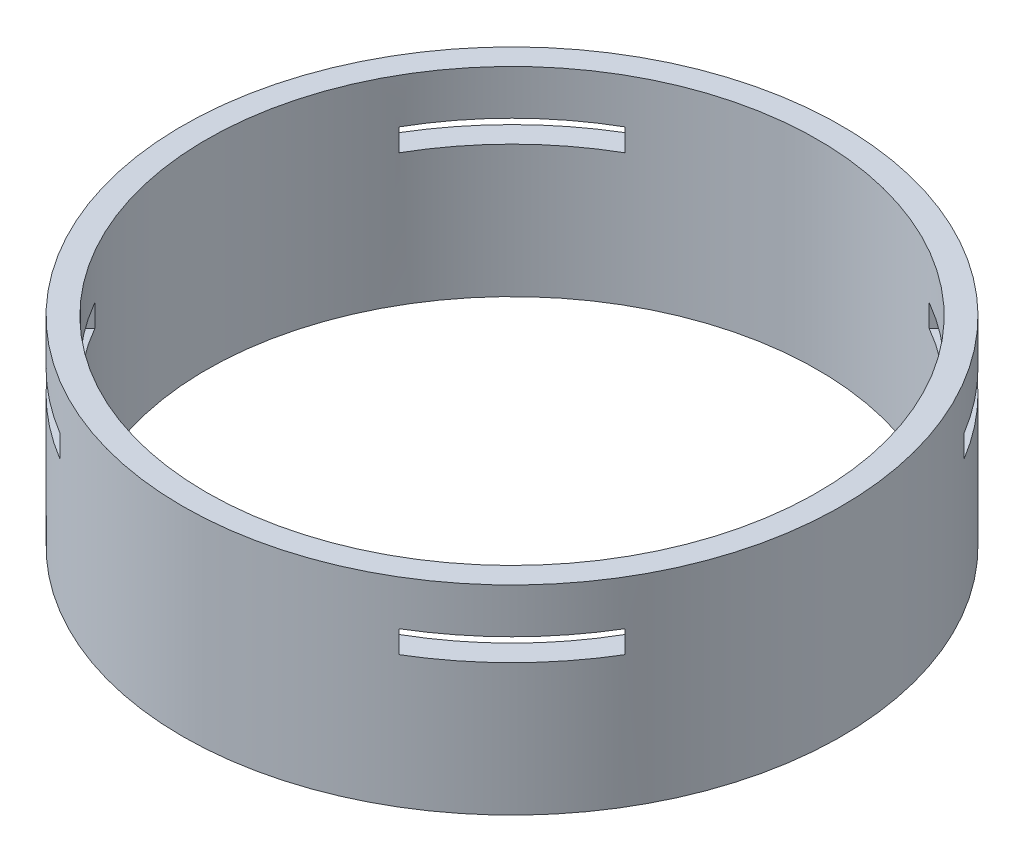
ISO-10303-21;
HEADER;
FILE_DESCRIPTION(('STEP AP214'),'2;1');
FILE_NAME('part.step','',(''),(''),'','','');
FILE_SCHEMA(('AUTOMOTIVE_DESIGN { 1 0 10303 214 1 1 1 1 }'));
ENDSEC;
DATA;
#1=APPLICATION_CONTEXT('core data for automotive mechanical design processes');
#2=APPLICATION_PROTOCOL_DEFINITION('international standard','automotive_design',2000,#1);
#3=PRODUCT_CONTEXT('',#1,'mechanical');
#4=PRODUCT('Part','Part','',(#3));
#5=PRODUCT_RELATED_PRODUCT_CATEGORY('part','',(#4));
#6=PRODUCT_DEFINITION_FORMATION('','',#4);
#7=PRODUCT_DEFINITION_CONTEXT('part definition',#1,'design');
#8=PRODUCT_DEFINITION('design','',#6,#7);
#9=PRODUCT_DEFINITION_SHAPE('','',#8);
#10=(LENGTH_UNIT() NAMED_UNIT(*) SI_UNIT(.MILLI.,.METRE.));
#11=(NAMED_UNIT(*) PLANE_ANGLE_UNIT() SI_UNIT($,.RADIAN.));
#12=(NAMED_UNIT(*) SI_UNIT($,.STERADIAN.) SOLID_ANGLE_UNIT());
#13=UNCERTAINTY_MEASURE_WITH_UNIT(LENGTH_MEASURE(1.E-05),#10,'distance_accuracy_value','');
#14=(GEOMETRIC_REPRESENTATION_CONTEXT(3) GLOBAL_UNCERTAINTY_ASSIGNED_CONTEXT((#13)) GLOBAL_UNIT_ASSIGNED_CONTEXT((#10,
#11,#12)) REPRESENTATION_CONTEXT('',''));
#15=CARTESIAN_POINT('',(0.,0.,0.));
#16=DIRECTION('',(0.,0.,1.));
#17=DIRECTION('',(1.,0.,0.));
#18=AXIS2_PLACEMENT_3D('',#15,#16,#17);
#19=CARTESIAN_POINT('',(0.,25.4,0.));
#20=DIRECTION('',(0.,1.,0.));
#21=DIRECTION('',(0.,0.,1.));
#22=AXIS2_PLACEMENT_3D('',#19,#20,#21);
#23=PLANE('',#22);
#24=CARTESIAN_POINT('',(0.,25.4,0.));
#25=DIRECTION('',(0.,1.,0.));
#26=DIRECTION('',(0.,0.,1.));
#27=AXIS2_PLACEMENT_3D('',#24,#25,#26);
#28=CIRCLE('',#27,83.9724);
#29=CARTESIAN_POINT('',(0.,25.4,83.9724));
#30=VERTEX_POINT('',#29);
#31=EDGE_CURVE('E214',#30,#30,#28,.T.);
#32=ORIENTED_EDGE('',*,*,#31,.T.);
#33=EDGE_LOOP('',(#32));
#34=FACE_BOUND('',#33,.T.);
#35=CARTESIAN_POINT('',(0.,25.4,0.));
#36=DIRECTION('',(0.,1.,0.));
#37=DIRECTION('',(0.,0.,1.));
#38=AXIS2_PLACEMENT_3D('',#35,#36,#37);
#39=CIRCLE('',#38,77.8764);
#40=CARTESIAN_POINT('',(0.,25.4,77.8764));
#41=VERTEX_POINT('',#40);
#42=EDGE_CURVE('E217',#41,#41,#39,.T.);
#43=ORIENTED_EDGE('',*,*,#42,.F.);
#44=EDGE_LOOP('',(#43));
#45=FACE_BOUND('',#44,.T.);
#46=ADVANCED_FACE('F37',(#34,#45),#23,.T.);
#47=CARTESIAN_POINT('',(0.,-25.4,0.));
#48=DIRECTION('',(0.,1.,0.));
#49=DIRECTION('',(0.,0.,1.));
#50=AXIS2_PLACEMENT_3D('',#47,#48,#49);
#51=PLANE('',#50);
#52=CARTESIAN_POINT('',(0.,-25.4,0.));
#53=DIRECTION('',(0.,1.,0.));
#54=DIRECTION('',(0.,0.,1.));
#55=AXIS2_PLACEMENT_3D('',#52,#53,#54);
#56=CIRCLE('',#55,83.9724);
#57=CARTESIAN_POINT('',(0.,-25.4,83.9724));
#58=VERTEX_POINT('',#57);
#59=EDGE_CURVE('E219',#58,#58,#56,.T.);
#60=ORIENTED_EDGE('',*,*,#59,.F.);
#61=EDGE_LOOP('',(#60));
#62=FACE_BOUND('',#61,.T.);
#63=CARTESIAN_POINT('',(0.,-25.4,0.));
#64=DIRECTION('',(0.,1.,0.));
#65=DIRECTION('',(0.,0.,1.));
#66=AXIS2_PLACEMENT_3D('',#63,#64,#65);
#67=CIRCLE('',#66,77.8764);
#68=CARTESIAN_POINT('',(0.,-25.4,77.8764));
#69=VERTEX_POINT('',#68);
#70=EDGE_CURVE('E220',#69,#69,#67,.T.);
#71=ORIENTED_EDGE('',*,*,#70,.T.);
#72=EDGE_LOOP('',(#71));
#73=FACE_BOUND('',#72,.T.);
#74=ADVANCED_FACE('F205',(#62,#73),#51,.F.);
#75=CARTESIAN_POINT('',(0.,25.4,0.));
#76=DIRECTION('',(0.,-1.,0.));
#77=DIRECTION('',(0.,0.,-1.));
#78=AXIS2_PLACEMENT_3D('',#75,#76,#77);
#79=CYLINDRICAL_SURFACE('',#78,83.9724);
#80=CARTESIAN_POINT('',(0.,8.255,0.));
#81=DIRECTION('',(0.,-1.,0.));
#82=DIRECTION('',(0.,0.,-1.));
#83=AXIS2_PLACEMENT_3D('',#80,#81,#82);
#84=CIRCLE('',#83,83.9724);
#85=CARTESIAN_POINT('',(-71.9811755742217,8.255,-43.2443559867999));
#86=VERTEX_POINT('',#85);
#87=CARTESIAN_POINT('',(-43.2443559868005,8.255,-71.9811755742213));
#88=VERTEX_POINT('',#87);
#89=EDGE_CURVE('E431',#86,#88,#84,.T.);
#90=ORIENTED_EDGE('',*,*,#89,.T.);
#91=DIRECTION('',(0.,-1.,0.));
#92=VECTOR('',#91,1.);
#93=CARTESIAN_POINT('',(-43.2443559868005,25.4,-71.9811755742213));
#94=LINE('',#93,#92);
#95=CARTESIAN_POINT('',(-43.2443559868005,13.97,-71.9811755742213));
#96=VERTEX_POINT('',#95);
#97=EDGE_CURVE('E434',#88,#96,#94,.F.);
#98=ORIENTED_EDGE('',*,*,#97,.T.);
#99=CARTESIAN_POINT('',(0.,13.97,0.));
#100=DIRECTION('',(0.,1.,0.));
#101=DIRECTION('',(0.,0.,1.));
#102=AXIS2_PLACEMENT_3D('',#99,#100,#101);
#103=CIRCLE('',#102,83.9724);
#104=CARTESIAN_POINT('',(-71.9811755742217,13.97,-43.2443559867999));
#105=VERTEX_POINT('',#104);
#106=EDGE_CURVE('E428',#96,#105,#103,.T.);
#107=ORIENTED_EDGE('',*,*,#106,.T.);
#108=DIRECTION('',(0.,-1.,0.));
#109=VECTOR('',#108,1.);
#110=CARTESIAN_POINT('',(-71.9811755742217,25.4,-43.2443559867999));
#111=LINE('',#110,#109);
#112=EDGE_CURVE('E291',#105,#86,#111,.T.);
#113=ORIENTED_EDGE('',*,*,#112,.T.);
#114=EDGE_LOOP('',(#90,#98,#107,#113));
#115=FACE_BOUND('',#114,.T.);
#116=CARTESIAN_POINT('',(-43.2443559868002,8.255,71.9811755742215));
#117=VERTEX_POINT('',#116);
#118=CARTESIAN_POINT('',(-71.9811755742215,8.255,43.2443559868002));
#119=VERTEX_POINT('',#118);
#120=EDGE_CURVE('E398',#117,#119,#84,.T.);
#121=ORIENTED_EDGE('',*,*,#120,.T.);
#122=DIRECTION('',(0.,-1.,0.));
#123=VECTOR('',#122,1.);
#124=CARTESIAN_POINT('',(-71.9811755742215,25.4,43.2443559868002));
#125=LINE('',#124,#123);
#126=CARTESIAN_POINT('',(-71.9811755742215,13.97,43.2443559868002));
#127=VERTEX_POINT('',#126);
#128=EDGE_CURVE('E423',#119,#127,#125,.F.);
#129=ORIENTED_EDGE('',*,*,#128,.T.);
#130=CARTESIAN_POINT('',(-43.2443559868002,13.97,71.9811755742215));
#131=VERTEX_POINT('',#130);
#132=EDGE_CURVE('E426',#127,#131,#103,.T.);
#133=ORIENTED_EDGE('',*,*,#132,.T.);
#134=DIRECTION('',(0.,-1.,0.));
#135=VECTOR('',#134,1.);
#136=CARTESIAN_POINT('',(-43.2443559868002,25.4,71.9811755742215));
#137=LINE('',#136,#135);
#138=EDGE_CURVE('E403',#131,#117,#137,.T.);
#139=ORIENTED_EDGE('',*,*,#138,.T.);
#140=EDGE_LOOP('',(#121,#129,#133,#139));
#141=FACE_BOUND('',#140,.T.);
#142=CARTESIAN_POINT('',(43.244355986801,13.97,71.981175574221));
#143=VERTEX_POINT('',#142);
#144=CARTESIAN_POINT('',(71.9811755742216,13.97,43.2443559867999));
#145=VERTEX_POINT('',#144);
#146=EDGE_CURVE('E429',#143,#145,#103,.T.);
#147=ORIENTED_EDGE('',*,*,#146,.T.);
#148=DIRECTION('',(0.,-1.,0.));
#149=VECTOR('',#148,1.);
#150=CARTESIAN_POINT('',(71.9811755742216,25.4,43.2443559867999));
#151=LINE('',#150,#149);
#152=CARTESIAN_POINT('',(71.9811755742216,8.255,43.2443559867999));
#153=VERTEX_POINT('',#152);
#154=EDGE_CURVE('E328',#145,#153,#151,.T.);
#155=ORIENTED_EDGE('',*,*,#154,.T.);
#156=CARTESIAN_POINT('',(43.244355986801,8.255,71.981175574221));
#157=VERTEX_POINT('',#156);
#158=EDGE_CURVE('E433',#153,#157,#84,.T.);
#159=ORIENTED_EDGE('',*,*,#158,.T.);
#160=DIRECTION('',(0.,-1.,0.));
#161=VECTOR('',#160,1.);
#162=CARTESIAN_POINT('',(43.244355986801,25.4,71.981175574221));
#163=LINE('',#162,#161);
#164=EDGE_CURVE('E419',#157,#143,#163,.F.);
#165=ORIENTED_EDGE('',*,*,#164,.T.);
#166=EDGE_LOOP('',(#147,#155,#159,#165));
#167=FACE_BOUND('',#166,.T.);
#168=CARTESIAN_POINT('',(0.,8.255,0.));
#169=DIRECTION('',(0.,-1.,0.));
#170=DIRECTION('',(0.,0.,-1.));
#171=AXIS2_PLACEMENT_3D('',#168,#169,#170);
#172=CIRCLE('',#171,83.9724);
#173=CARTESIAN_POINT('',(43.2443559868002,8.255,-71.9811755742215));
#174=VERTEX_POINT('',#173);
#175=CARTESIAN_POINT('',(71.9811755742215,8.255,-43.2443559868002));
#176=VERTEX_POINT('',#175);
#177=EDGE_CURVE('E335',#174,#176,#172,.T.);
#178=ORIENTED_EDGE('',*,*,#177,.T.);
#179=DIRECTION('',(0.,-1.,0.));
#180=VECTOR('',#179,1.);
#181=CARTESIAN_POINT('',(71.9811755742215,25.4,-43.2443559868002));
#182=LINE('',#181,#180);
#183=CARTESIAN_POINT('',(71.9811755742215,13.97,-43.2443559868002));
#184=VERTEX_POINT('',#183);
#185=EDGE_CURVE('E225',#176,#184,#182,.F.);
#186=ORIENTED_EDGE('',*,*,#185,.T.);
#187=CARTESIAN_POINT('',(0.,13.97,0.));
#188=DIRECTION('',(0.,1.,0.));
#189=DIRECTION('',(0.,0.,1.));
#190=AXIS2_PLACEMENT_3D('',#187,#188,#189);
#191=CIRCLE('',#190,83.9724);
#192=CARTESIAN_POINT('',(43.2443559868002,13.97,-71.9811755742215));
#193=VERTEX_POINT('',#192);
#194=EDGE_CURVE('E318',#184,#193,#191,.T.);
#195=ORIENTED_EDGE('',*,*,#194,.T.);
#196=DIRECTION('',(0.,-1.,0.));
#197=VECTOR('',#196,1.);
#198=CARTESIAN_POINT('',(43.2443559868002,25.4,-71.9811755742215));
#199=LINE('',#198,#197);
#200=EDGE_CURVE('E322',#193,#174,#199,.T.);
#201=ORIENTED_EDGE('',*,*,#200,.T.);
#202=EDGE_LOOP('',(#178,#186,#195,#201));
#203=FACE_BOUND('',#202,.T.);
#204=ORIENTED_EDGE('',*,*,#31,.F.);
#205=EDGE_LOOP('',(#204));
#206=FACE_BOUND('',#205,.T.);
#207=ORIENTED_EDGE('',*,*,#59,.T.);
#208=EDGE_LOOP('',(#207));
#209=FACE_BOUND('',#208,.T.);
#210=ADVANCED_FACE('F39',(#115,#141,#167,#203,#206,#209),#79,.T.);
#211=CARTESIAN_POINT('',(0.,25.4,0.));
#212=DIRECTION('',(0.,-1.,0.));
#213=DIRECTION('',(0.,0.,-1.));
#214=AXIS2_PLACEMENT_3D('',#211,#212,#213);
#215=CYLINDRICAL_SURFACE('',#214,77.8764);
#216=CARTESIAN_POINT('',(73.3508964323165,-16.148738026056,26.1606511680343));
#217=CARTESIAN_POINT('',(73.3168874799224,-15.24,26.2875743062813));
#218=CARTESIAN_POINT('',(73.3508964323165,-14.331261973944,26.1606511680343));
#219=B_SPLINE_CURVE_WITH_KNOTS('',2,(#216,#217,#218),.UNSPECIFIED.,.F.,.F.,(3,3),(0.,1.),.UNSPECIFIED.);
#220=CARTESIAN_POINT('',(73.3508964323165,-16.148738026056,26.1606511680343));
#221=VERTEX_POINT('',#220);
#222=CARTESIAN_POINT('',(73.3508964323165,-14.331261973944,26.1606511680343));
#223=VERTEX_POINT('',#222);
#224=EDGE_CURVE('E11',#221,#223,#219,.T.);
#225=ORIENTED_EDGE('',*,*,#224,.F.);
#226=DIRECTION('',(0.,-1.,0.));
#227=VECTOR('',#226,1.);
#228=CARTESIAN_POINT('',(73.3508964323165,25.4,26.1606511680343));
#229=LINE('',#228,#227);
#230=EDGE_CURVE('E41',#223,#221,#229,.T.);
#231=ORIENTED_EDGE('',*,*,#230,.F.);
#232=EDGE_LOOP('',(#225,#231));
#233=FACE_BOUND('',#232,.T.);
#234=CARTESIAN_POINT('',(76.6040652847646,-14.331261973944,14.0196597250976));
#235=CARTESIAN_POINT('',(76.6380742371587,-15.24,13.8927365868506));
#236=CARTESIAN_POINT('',(76.6040652847646,-16.148738026056,14.0196597250976));
#237=B_SPLINE_CURVE_WITH_KNOTS('',2,(#234,#235,#236),.UNSPECIFIED.,.F.,.F.,(3,3),(0.,1.),.UNSPECIFIED.);
#238=CARTESIAN_POINT('',(76.6040652847646,-14.331261973944,14.0196597250976));
#239=VERTEX_POINT('',#238);
#240=CARTESIAN_POINT('',(76.6040652847646,-16.148738026056,14.0196597250976));
#241=VERTEX_POINT('',#240);
#242=EDGE_CURVE('E58',#239,#241,#237,.T.);
#243=ORIENTED_EDGE('',*,*,#242,.F.);
#244=DIRECTION('',(0.,-1.,0.));
#245=VECTOR('',#244,1.);
#246=CARTESIAN_POINT('',(76.6040652847646,25.4,14.0196597250976));
#247=LINE('',#246,#245);
#248=EDGE_CURVE('E160',#241,#239,#247,.F.);
#249=ORIENTED_EDGE('',*,*,#248,.F.);
#250=EDGE_LOOP('',(#243,#249));
#251=FACE_BOUND('',#250,.T.);
#252=DIRECTION('',(0.,-1.,0.));
#253=VECTOR('',#252,1.);
#254=CARTESIAN_POINT('',(-38.7909321743765,25.4,-67.5277517617973));
#255=LINE('',#254,#253);
#256=CARTESIAN_POINT('',(-38.7909321743765,8.255,-67.5277517617974));
#257=VERTEX_POINT('',#256);
#258=CARTESIAN_POINT('',(-38.7909321743765,13.97,-67.5277517617974));
#259=VERTEX_POINT('',#258);
#260=EDGE_CURVE('E163',#257,#259,#255,.F.);
#261=ORIENTED_EDGE('',*,*,#260,.F.);
#262=CARTESIAN_POINT('',(0.,8.255,0.));
#263=DIRECTION('',(0.,-1.,0.));
#264=DIRECTION('',(0.,0.,-1.));
#265=AXIS2_PLACEMENT_3D('',#262,#263,#264);
#266=CIRCLE('',#265,77.8764);
#267=CARTESIAN_POINT('',(-67.5277517617976,8.255,-38.7909321743759));
#268=VERTEX_POINT('',#267);
#269=EDGE_CURVE('E250',#268,#257,#266,.T.);
#270=ORIENTED_EDGE('',*,*,#269,.F.);
#271=DIRECTION('',(0.,-1.,0.));
#272=VECTOR('',#271,1.);
#273=CARTESIAN_POINT('',(-67.5277517617977,25.4,-38.7909321743759));
#274=LINE('',#273,#272);
#275=CARTESIAN_POINT('',(-67.5277517617977,13.97,-38.7909321743759));
#276=VERTEX_POINT('',#275);
#277=EDGE_CURVE('E257',#276,#268,#274,.T.);
#278=ORIENTED_EDGE('',*,*,#277,.F.);
#279=CARTESIAN_POINT('',(0.,13.97,0.));
#280=DIRECTION('',(0.,1.,0.));
#281=DIRECTION('',(0.,0.,1.));
#282=AXIS2_PLACEMENT_3D('',#279,#280,#281);
#283=CIRCLE('',#282,77.8764);
#284=EDGE_CURVE('E245',#259,#276,#283,.T.);
#285=ORIENTED_EDGE('',*,*,#284,.F.);
#286=EDGE_LOOP('',(#261,#270,#278,#285));
#287=FACE_BOUND('',#286,.T.);
#288=DIRECTION('',(0.,-1.,0.));
#289=VECTOR('',#288,1.);
#290=CARTESIAN_POINT('',(-67.5277517617975,25.4,38.7909321743763));
#291=LINE('',#290,#289);
#292=CARTESIAN_POINT('',(-67.5277517617975,8.255,38.7909321743762));
#293=VERTEX_POINT('',#292);
#294=CARTESIAN_POINT('',(-67.5277517617975,13.97,38.7909321743762));
#295=VERTEX_POINT('',#294);
#296=EDGE_CURVE('E255',#293,#295,#291,.F.);
#297=ORIENTED_EDGE('',*,*,#296,.F.);
#298=CARTESIAN_POINT('',(-38.7909321743762,8.255,67.5277517617975));
#299=VERTEX_POINT('',#298);
#300=EDGE_CURVE('E251',#299,#293,#266,.T.);
#301=ORIENTED_EDGE('',*,*,#300,.F.);
#302=DIRECTION('',(0.,-1.,0.));
#303=VECTOR('',#302,1.);
#304=CARTESIAN_POINT('',(-38.7909321743762,25.4,67.5277517617975));
#305=LINE('',#304,#303);
#306=CARTESIAN_POINT('',(-38.7909321743762,13.97,67.5277517617975));
#307=VERTEX_POINT('',#306);
#308=EDGE_CURVE('E253',#307,#299,#305,.T.);
#309=ORIENTED_EDGE('',*,*,#308,.F.);
#310=EDGE_CURVE('E246',#295,#307,#283,.T.);
#311=ORIENTED_EDGE('',*,*,#310,.F.);
#312=EDGE_LOOP('',(#297,#301,#309,#311));
#313=FACE_BOUND('',#312,.T.);
#314=DIRECTION('',(0.,-1.,0.));
#315=VECTOR('',#314,1.);
#316=CARTESIAN_POINT('',(67.5277517617976,25.4,38.790932174376));
#317=LINE('',#316,#315);
#318=CARTESIAN_POINT('',(67.5277517617976,13.97,38.790932174376));
#319=VERTEX_POINT('',#318);
#320=CARTESIAN_POINT('',(67.5277517617976,8.255,38.790932174376));
#321=VERTEX_POINT('',#320);
#322=EDGE_CURVE('E249',#319,#321,#317,.T.);
#323=ORIENTED_EDGE('',*,*,#322,.F.);
#324=CARTESIAN_POINT('',(38.790932174377,13.97,67.5277517617971));
#325=VERTEX_POINT('',#324);
#326=EDGE_CURVE('E242',#325,#319,#283,.T.);
#327=ORIENTED_EDGE('',*,*,#326,.F.);
#328=DIRECTION('',(0.,-1.,0.));
#329=VECTOR('',#328,1.);
#330=CARTESIAN_POINT('',(38.7909321743769,25.4,67.5277517617971));
#331=LINE('',#330,#329);
#332=CARTESIAN_POINT('',(38.7909321743769,8.255,67.5277517617971));
#333=VERTEX_POINT('',#332);
#334=EDGE_CURVE('E240',#333,#325,#331,.F.);
#335=ORIENTED_EDGE('',*,*,#334,.F.);
#336=EDGE_CURVE('E244',#321,#333,#266,.T.);
#337=ORIENTED_EDGE('',*,*,#336,.F.);
#338=EDGE_LOOP('',(#323,#327,#335,#337));
#339=FACE_BOUND('',#338,.T.);
#340=DIRECTION('',(0.,-1.,0.));
#341=VECTOR('',#340,1.);
#342=CARTESIAN_POINT('',(67.5277517617975,25.4,-38.7909321743763));
#343=LINE('',#342,#341);
#344=CARTESIAN_POINT('',(67.5277517617975,8.255,-38.7909321743762));
#345=VERTEX_POINT('',#344);
#346=CARTESIAN_POINT('',(67.5277517617975,13.97,-38.7909321743763));
#347=VERTEX_POINT('',#346);
#348=EDGE_CURVE('E237',#345,#347,#343,.F.);
#349=ORIENTED_EDGE('',*,*,#348,.F.);
#350=CARTESIAN_POINT('',(0.,8.255,0.));
#351=DIRECTION('',(0.,-1.,0.));
#352=DIRECTION('',(0.,0.,-1.));
#353=AXIS2_PLACEMENT_3D('',#350,#351,#352);
#354=CIRCLE('',#353,77.8764);
#355=CARTESIAN_POINT('',(38.7909321743762,8.255,-67.5277517617975));
#356=VERTEX_POINT('',#355);
#357=EDGE_CURVE('E235',#356,#345,#354,.T.);
#358=ORIENTED_EDGE('',*,*,#357,.F.);
#359=DIRECTION('',(0.,-1.,0.));
#360=VECTOR('',#359,1.);
#361=CARTESIAN_POINT('',(38.7909321743762,25.4,-67.5277517617975));
#362=LINE('',#361,#360);
#363=CARTESIAN_POINT('',(38.7909321743762,13.97,-67.5277517617975));
#364=VERTEX_POINT('',#363);
#365=EDGE_CURVE('E233',#364,#356,#362,.T.);
#366=ORIENTED_EDGE('',*,*,#365,.F.);
#367=CARTESIAN_POINT('',(0.,13.97,0.));
#368=DIRECTION('',(0.,1.,0.));
#369=DIRECTION('',(0.,0.,1.));
#370=AXIS2_PLACEMENT_3D('',#367,#368,#369);
#371=CIRCLE('',#370,77.8764);
#372=EDGE_CURVE('E230',#347,#364,#371,.T.);
#373=ORIENTED_EDGE('',*,*,#372,.F.);
#374=EDGE_LOOP('',(#349,#358,#366,#373));
#375=FACE_BOUND('',#374,.T.);
#376=ORIENTED_EDGE('',*,*,#42,.T.);
#377=EDGE_LOOP('',(#376));
#378=FACE_BOUND('',#377,.T.);
#379=ORIENTED_EDGE('',*,*,#70,.F.);
#380=EDGE_LOOP('',(#379));
#381=FACE_BOUND('',#380,.T.);
#382=ADVANCED_FACE('F166',(#233,#251,#287,#313,#339,#375,#378,#381),#215,.F.);
#383=CARTESIAN_POINT('',(98.3408097937106,13.97,-69.6039902062894));
#384=DIRECTION('',(0.707106781186548,0.,0.707106781186547));
#385=DIRECTION('',(0.707106781186547,0.,-0.707106781186548));
#386=AXIS2_PLACEMENT_3D('',#383,#384,#385);
#387=PLANE('',#386);
#388=DIRECTION('',(-0.707106781186547,0.,0.707106781186548));
#389=VECTOR('',#388,1.);
#390=CARTESIAN_POINT('',(98.3408097937106,8.255,-69.6039902062894));
#391=LINE('',#390,#389);
#392=EDGE_CURVE('E315',#176,#345,#391,.T.);
#393=ORIENTED_EDGE('',*,*,#392,.T.);
#394=ORIENTED_EDGE('',*,*,#348,.T.);
#395=DIRECTION('',(-0.707106781186547,0.,0.707106781186548));
#396=VECTOR('',#395,1.);
#397=CARTESIAN_POINT('',(98.3408097937106,13.97,-69.6039902062894));
#398=LINE('',#397,#396);
#399=EDGE_CURVE('E312',#184,#347,#398,.T.);
#400=ORIENTED_EDGE('',*,*,#399,.F.);
#401=ORIENTED_EDGE('',*,*,#185,.F.);
#402=EDGE_LOOP('',(#393,#394,#400,#401));
#403=FACE_BOUND('',#402,.T.);
#404=ADVANCED_FACE('F184',(#403),#387,.F.);
#405=CARTESIAN_POINT('',(69.6039902062893,8.255,-98.3408097937107));
#406=DIRECTION('',(0.,-1.,0.));
#407=DIRECTION('',(0.,0.,-1.));
#408=AXIS2_PLACEMENT_3D('',#405,#406,#407);
#409=PLANE('',#408);
#410=DIRECTION('',(-0.707106781186547,0.,0.707106781186548));
#411=VECTOR('',#410,1.);
#412=CARTESIAN_POINT('',(69.6039902062893,8.255,-98.3408097937107));
#413=LINE('',#412,#411);
#414=EDGE_CURVE('E319',#174,#356,#413,.T.);
#415=ORIENTED_EDGE('',*,*,#414,.T.);
#416=ORIENTED_EDGE('',*,*,#357,.T.);
#417=ORIENTED_EDGE('',*,*,#392,.F.);
#418=ORIENTED_EDGE('',*,*,#177,.F.);
#419=EDGE_LOOP('',(#415,#416,#417,#418));
#420=FACE_BOUND('',#419,.T.);
#421=ADVANCED_FACE('F344',(#420),#409,.F.);
#422=CARTESIAN_POINT('',(69.6039902062893,13.97,-98.3408097937107));
#423=DIRECTION('',(-0.707106781186548,0.,-0.707106781186547));
#424=DIRECTION('',(-0.707106781186547,0.,0.707106781186548));
#425=AXIS2_PLACEMENT_3D('',#422,#423,#424);
#426=PLANE('',#425);
#427=DIRECTION('',(-0.707106781186547,0.,0.707106781186548));
#428=VECTOR('',#427,1.);
#429=CARTESIAN_POINT('',(69.6039902062893,13.97,-98.3408097937107));
#430=LINE('',#429,#428);
#431=EDGE_CURVE('E325',#193,#364,#430,.T.);
#432=ORIENTED_EDGE('',*,*,#431,.T.);
#433=ORIENTED_EDGE('',*,*,#365,.T.);
#434=ORIENTED_EDGE('',*,*,#414,.F.);
#435=ORIENTED_EDGE('',*,*,#200,.F.);
#436=EDGE_LOOP('',(#432,#433,#434,#435));
#437=FACE_BOUND('',#436,.T.);
#438=ADVANCED_FACE('F343',(#437),#426,.F.);
#439=CARTESIAN_POINT('',(69.6039902062893,13.97,-98.3408097937107));
#440=DIRECTION('',(0.,1.,0.));
#441=DIRECTION('',(0.,0.,1.));
#442=AXIS2_PLACEMENT_3D('',#439,#440,#441);
#443=PLANE('',#442);
#444=ORIENTED_EDGE('',*,*,#399,.T.);
#445=ORIENTED_EDGE('',*,*,#372,.T.);
#446=ORIENTED_EDGE('',*,*,#431,.F.);
#447=ORIENTED_EDGE('',*,*,#194,.F.);
#448=EDGE_LOOP('',(#444,#445,#446,#447));
#449=FACE_BOUND('',#448,.T.);
#450=ADVANCED_FACE('F340',(#449),#443,.F.);
#451=CARTESIAN_POINT('',(69.6039902062904,13.97,98.3408097937099));
#452=DIRECTION('',(-0.70710678118654,0.,0.707106781186555));
#453=DIRECTION('',(0.707106781186555,0.,0.70710678118654));
#454=AXIS2_PLACEMENT_3D('',#451,#452,#453);
#455=PLANE('',#454);
#456=DIRECTION('',(-0.707106781186555,0.,-0.70710678118654));
#457=VECTOR('',#456,1.);
#458=CARTESIAN_POINT('',(69.6039902062904,8.255,98.3408097937099));
#459=LINE('',#458,#457);
#460=EDGE_CURVE('E407',#157,#333,#459,.T.);
#461=ORIENTED_EDGE('',*,*,#460,.T.);
#462=ORIENTED_EDGE('',*,*,#334,.T.);
#463=DIRECTION('',(-0.707106781186555,0.,-0.70710678118654));
#464=VECTOR('',#463,1.);
#465=CARTESIAN_POINT('',(69.6039902062904,13.97,98.3408097937099));
#466=LINE('',#465,#464);
#467=EDGE_CURVE('E443',#143,#325,#466,.T.);
#468=ORIENTED_EDGE('',*,*,#467,.F.);
#469=ORIENTED_EDGE('',*,*,#164,.F.);
#470=EDGE_LOOP('',(#461,#462,#468,#469));
#471=FACE_BOUND('',#470,.T.);
#472=ADVANCED_FACE('F356',(#471),#455,.F.);
#473=CARTESIAN_POINT('',(-98.3408097937109,13.97,-69.603990206289));
#474=DIRECTION('',(0.,1.,0.));
#475=DIRECTION('',(0.,0.,1.));
#476=AXIS2_PLACEMENT_3D('',#473,#474,#475);
#477=PLANE('',#476);
#478=ORIENTED_EDGE('',*,*,#467,.T.);
#479=ORIENTED_EDGE('',*,*,#326,.T.);
#480=DIRECTION('',(0.70710678118655,0.,0.707106781186545));
#481=VECTOR('',#480,1.);
#482=CARTESIAN_POINT('',(-69.6039902062897,13.97,-98.3408097937104));
#483=LINE('',#482,#481);
#484=EDGE_CURVE('E416',#319,#145,#483,.T.);
#485=ORIENTED_EDGE('',*,*,#484,.T.);
#486=ORIENTED_EDGE('',*,*,#146,.F.);
#487=EDGE_LOOP('',(#478,#479,#485,#486));
#488=FACE_BOUND('',#487,.T.);
#489=ADVANCED_FACE('F360',(#488),#477,.F.);
#490=CARTESIAN_POINT('',(-98.3408097937109,8.255,-69.603990206289));
#491=DIRECTION('',(0.,-1.,0.));
#492=DIRECTION('',(0.,0.,-1.));
#493=AXIS2_PLACEMENT_3D('',#490,#491,#492);
#494=PLANE('',#493);
#495=DIRECTION('',(0.70710678118655,0.,0.707106781186545));
#496=VECTOR('',#495,1.);
#497=CARTESIAN_POINT('',(-69.6039902062897,8.255,-98.3408097937104));
#498=LINE('',#497,#496);
#499=EDGE_CURVE('E411',#321,#153,#498,.T.);
#500=ORIENTED_EDGE('',*,*,#499,.F.);
#501=ORIENTED_EDGE('',*,*,#336,.T.);
#502=ORIENTED_EDGE('',*,*,#460,.F.);
#503=ORIENTED_EDGE('',*,*,#158,.F.);
#504=EDGE_LOOP('',(#500,#501,#502,#503));
#505=FACE_BOUND('',#504,.T.);
#506=ADVANCED_FACE('F365',(#505),#494,.F.);
#507=CARTESIAN_POINT('',(-69.6039902062897,13.97,-98.3408097937104));
#508=DIRECTION('',(0.707106781186545,0.,-0.70710678118655));
#509=DIRECTION('',(-0.70710678118655,0.,-0.707106781186545));
#510=AXIS2_PLACEMENT_3D('',#507,#508,#509);
#511=PLANE('',#510);
#512=ORIENTED_EDGE('',*,*,#484,.F.);
#513=ORIENTED_EDGE('',*,*,#322,.T.);
#514=ORIENTED_EDGE('',*,*,#499,.T.);
#515=ORIENTED_EDGE('',*,*,#154,.F.);
#516=EDGE_LOOP('',(#512,#513,#514,#515));
#517=FACE_BOUND('',#516,.T.);
#518=ADVANCED_FACE('F353',(#517),#511,.F.);
#519=CARTESIAN_POINT('',(-69.6039902062893,13.97,98.3408097937107));
#520=DIRECTION('',(0.707106781186548,0.,0.707106781186547));
#521=DIRECTION('',(0.707106781186547,0.,-0.707106781186548));
#522=AXIS2_PLACEMENT_3D('',#519,#520,#521);
#523=PLANE('',#522);
#524=DIRECTION('',(0.707106781186547,0.,-0.707106781186548));
#525=VECTOR('',#524,1.);
#526=CARTESIAN_POINT('',(-69.6039902062893,13.97,98.3408097937107));
#527=LINE('',#526,#525);
#528=EDGE_CURVE('E401',#131,#307,#527,.T.);
#529=ORIENTED_EDGE('',*,*,#528,.T.);
#530=ORIENTED_EDGE('',*,*,#308,.T.);
#531=DIRECTION('',(0.707106781186547,0.,-0.707106781186548));
#532=VECTOR('',#531,1.);
#533=CARTESIAN_POINT('',(-69.6039902062893,8.255,98.3408097937107));
#534=LINE('',#533,#532);
#535=EDGE_CURVE('E396',#117,#299,#534,.T.);
#536=ORIENTED_EDGE('',*,*,#535,.F.);
#537=ORIENTED_EDGE('',*,*,#138,.F.);
#538=EDGE_LOOP('',(#529,#530,#536,#537));
#539=FACE_BOUND('',#538,.T.);
#540=ADVANCED_FACE('F369',(#539),#523,.F.);
#541=CARTESIAN_POINT('',(-98.3408097937106,13.97,69.6039902062894));
#542=DIRECTION('',(-0.707106781186548,0.,-0.707106781186547));
#543=DIRECTION('',(-0.707106781186547,0.,0.707106781186548));
#544=AXIS2_PLACEMENT_3D('',#541,#542,#543);
#545=PLANE('',#544);
#546=DIRECTION('',(0.707106781186547,0.,-0.707106781186548));
#547=VECTOR('',#546,1.);
#548=CARTESIAN_POINT('',(-98.3408097937106,8.255,69.6039902062894));
#549=LINE('',#548,#547);
#550=EDGE_CURVE('E400',#119,#293,#549,.T.);
#551=ORIENTED_EDGE('',*,*,#550,.T.);
#552=ORIENTED_EDGE('',*,*,#296,.T.);
#553=DIRECTION('',(0.707106781186547,0.,-0.707106781186548));
#554=VECTOR('',#553,1.);
#555=CARTESIAN_POINT('',(-98.3408097937106,13.97,69.6039902062894));
#556=LINE('',#555,#554);
#557=EDGE_CURVE('E405',#127,#295,#556,.T.);
#558=ORIENTED_EDGE('',*,*,#557,.F.);
#559=ORIENTED_EDGE('',*,*,#128,.F.);
#560=EDGE_LOOP('',(#551,#552,#558,#559));
#561=FACE_BOUND('',#560,.T.);
#562=ADVANCED_FACE('F372',(#561),#545,.F.);
#563=ORIENTED_EDGE('',*,*,#557,.T.);
#564=ORIENTED_EDGE('',*,*,#310,.T.);
#565=ORIENTED_EDGE('',*,*,#528,.F.);
#566=ORIENTED_EDGE('',*,*,#132,.F.);
#567=EDGE_LOOP('',(#563,#564,#565,#566));
#568=FACE_BOUND('',#567,.T.);
#569=ADVANCED_FACE('F367',(#568),#477,.F.);
#570=ORIENTED_EDGE('',*,*,#535,.T.);
#571=ORIENTED_EDGE('',*,*,#300,.T.);
#572=ORIENTED_EDGE('',*,*,#550,.F.);
#573=ORIENTED_EDGE('',*,*,#120,.F.);
#574=EDGE_LOOP('',(#570,#571,#572,#573));
#575=FACE_BOUND('',#574,.T.);
#576=ADVANCED_FACE('F380',(#575),#494,.F.);
#577=EDGE_CURVE('E414',#88,#257,#498,.T.);
#578=ORIENTED_EDGE('',*,*,#577,.T.);
#579=ORIENTED_EDGE('',*,*,#260,.T.);
#580=EDGE_CURVE('E285',#96,#259,#483,.T.);
#581=ORIENTED_EDGE('',*,*,#580,.F.);
#582=ORIENTED_EDGE('',*,*,#97,.F.);
#583=EDGE_LOOP('',(#578,#579,#581,#582));
#584=FACE_BOUND('',#583,.T.);
#585=ADVANCED_FACE('F387',(#584),#511,.F.);
#586=DIRECTION('',(0.70710678118655,0.,0.707106781186545));
#587=VECTOR('',#586,1.);
#588=CARTESIAN_POINT('',(-98.3408097937109,8.255,-69.603990206289));
#589=LINE('',#588,#587);
#590=EDGE_CURVE('E293',#86,#268,#589,.T.);
#591=ORIENTED_EDGE('',*,*,#590,.T.);
#592=ORIENTED_EDGE('',*,*,#269,.T.);
#593=ORIENTED_EDGE('',*,*,#577,.F.);
#594=ORIENTED_EDGE('',*,*,#89,.F.);
#595=EDGE_LOOP('',(#591,#592,#593,#594));
#596=FACE_BOUND('',#595,.T.);
#597=ADVANCED_FACE('F381',(#596),#494,.F.);
#598=CARTESIAN_POINT('',(-98.3408097937109,13.97,-69.603990206289));
#599=DIRECTION('',(-0.707106781186545,0.,0.70710678118655));
#600=DIRECTION('',(0.70710678118655,0.,0.707106781186545));
#601=AXIS2_PLACEMENT_3D('',#598,#599,#600);
#602=PLANE('',#601);
#603=DIRECTION('',(0.70710678118655,0.,0.707106781186545));
#604=VECTOR('',#603,1.);
#605=CARTESIAN_POINT('',(-98.3408097937109,13.97,-69.603990206289));
#606=LINE('',#605,#604);
#607=EDGE_CURVE('E283',#105,#276,#606,.T.);
#608=ORIENTED_EDGE('',*,*,#607,.T.);
#609=ORIENTED_EDGE('',*,*,#277,.T.);
#610=ORIENTED_EDGE('',*,*,#590,.F.);
#611=ORIENTED_EDGE('',*,*,#112,.F.);
#612=EDGE_LOOP('',(#608,#609,#610,#611));
#613=FACE_BOUND('',#612,.T.);
#614=ADVANCED_FACE('F288',(#613),#602,.F.);
#615=ORIENTED_EDGE('',*,*,#580,.T.);
#616=ORIENTED_EDGE('',*,*,#284,.T.);
#617=ORIENTED_EDGE('',*,*,#607,.F.);
#618=ORIENTED_EDGE('',*,*,#106,.F.);
#619=EDGE_LOOP('',(#615,#616,#617,#618));
#620=FACE_BOUND('',#619,.T.);
#621=ADVANCED_FACE('F201',(#620),#477,.F.);
#622=CARTESIAN_POINT('',(74.9774808585406,-15.24,20.090155446566));
#623=DIRECTION('',(0.965925826289068,0.,0.258819045102521));
#624=DIRECTION('',(0.258819045102521,0.,-0.965925826289068));
#625=AXIS2_PLACEMENT_3D('',#622,#623,#624);
#626=PLANE('',#625);
#627=ORIENTED_EDGE('',*,*,#248,.T.);
#628=ORIENTED_EDGE('',*,*,#242,.T.);
#629=EDGE_LOOP('',(#627,#628));
#630=FACE_BOUND('',#629,.T.);
#631=ADVANCED_FACE('F161',(#630),#626,.F.);
#632=ORIENTED_EDGE('',*,*,#230,.T.);
#633=ORIENTED_EDGE('',*,*,#224,.T.);
#634=EDGE_LOOP('',(#632,#633));
#635=FACE_BOUND('',#634,.T.);
#636=ADVANCED_FACE('F195',(#635),#626,.F.);
#637=CLOSED_SHELL('',(#46,#74,#210,#382,#404,#421,#438,#450,#472,#489,#506,#518,#540,#562,#569,
#576,#585,#597,#614,#621,#631,#636));
#638=MANIFOLD_SOLID_BREP('B2',#637);
#639=ADVANCED_BREP_SHAPE_REPRESENTATION('',(#18,#638),#14);
#640=SHAPE_DEFINITION_REPRESENTATION(#9,#639);
ENDSEC;
END-ISO-10303-21;
